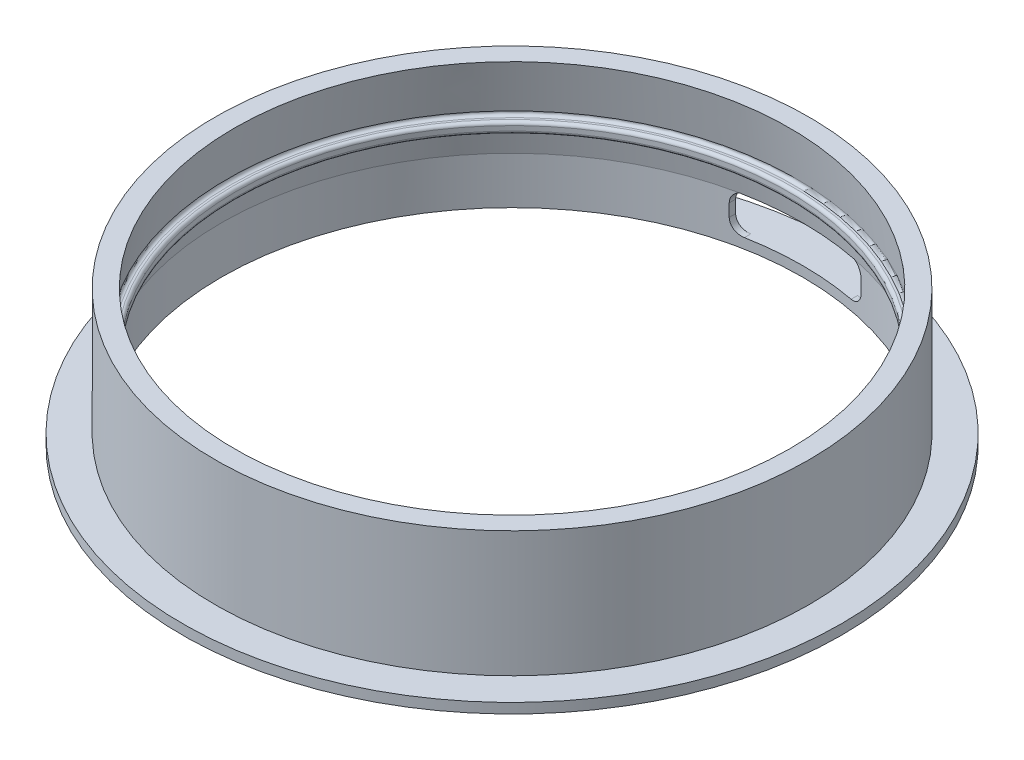
ISO-10303-21;
HEADER;
FILE_DESCRIPTION(('STEP AP214'),'2;1');
FILE_NAME('part.step','',(''),(''),'','','');
FILE_SCHEMA(('AUTOMOTIVE_DESIGN { 1 0 10303 214 1 1 1 1 }'));
ENDSEC;
DATA;
#1=APPLICATION_CONTEXT('core data for automotive mechanical design processes');
#2=APPLICATION_PROTOCOL_DEFINITION('international standard','automotive_design',2000,#1);
#3=PRODUCT_CONTEXT('',#1,'mechanical');
#4=PRODUCT('Part','Part','',(#3));
#5=PRODUCT_RELATED_PRODUCT_CATEGORY('part','',(#4));
#6=PRODUCT_DEFINITION_FORMATION('','',#4);
#7=PRODUCT_DEFINITION_CONTEXT('part definition',#1,'design');
#8=PRODUCT_DEFINITION('design','',#6,#7);
#9=PRODUCT_DEFINITION_SHAPE('','',#8);
#10=(LENGTH_UNIT() NAMED_UNIT(*) SI_UNIT(.MILLI.,.METRE.));
#11=(NAMED_UNIT(*) PLANE_ANGLE_UNIT() SI_UNIT($,.RADIAN.));
#12=(NAMED_UNIT(*) SI_UNIT($,.STERADIAN.) SOLID_ANGLE_UNIT());
#13=UNCERTAINTY_MEASURE_WITH_UNIT(LENGTH_MEASURE(1.E-05),#10,'distance_accuracy_value','');
#14=(GEOMETRIC_REPRESENTATION_CONTEXT(3) GLOBAL_UNCERTAINTY_ASSIGNED_CONTEXT((#13)) GLOBAL_UNIT_ASSIGNED_CONTEXT((#10,
#11,#12)) REPRESENTATION_CONTEXT('',''));
#15=CARTESIAN_POINT('',(0.,0.,0.));
#16=DIRECTION('',(0.,0.,1.));
#17=DIRECTION('',(1.,0.,0.));
#18=AXIS2_PLACEMENT_3D('',#15,#16,#17);
#19=CARTESIAN_POINT('',(3.43024899888577E-12,-1000.,0.));
#20=DIRECTION('',(0.,-1.,0.));
#21=DIRECTION('',(1.,0.,0.));
#22=AXIS2_PLACEMENT_3D('',#19,#20,#21);
#23=CYLINDRICAL_SURFACE('',#22,46.3);
#24=CARTESIAN_POINT('',(0.,-1.11022302462516E-13,0.));
#25=DIRECTION('',(0.,-1.,0.));
#26=DIRECTION('',(1.,0.,0.));
#27=AXIS2_PLACEMENT_3D('',#24,#25,#26);
#28=CIRCLE('',#27,46.3);
#29=CARTESIAN_POINT('',(46.3,0.,0.));
#30=VERTEX_POINT('',#29);
#31=EDGE_CURVE('E229',#30,#30,#28,.T.);
#32=ORIENTED_EDGE('',*,*,#31,.T.);
#33=EDGE_LOOP('',(#32));
#34=FACE_BOUND('',#33,.T.);
#35=CARTESIAN_POINT('',(-10.5,5.6,-45.0936802667506));
#36=CARTESIAN_POINT('',(-10.5000004104109,5.65526649087846,-45.0936795736649));
#37=CARTESIAN_POINT('',(-10.4977077190256,5.7105060555035,-45.094214086322));
#38=CARTESIAN_POINT('',(-10.4885664548555,5.82058035333635,-45.0963413854431));
#39=CARTESIAN_POINT('',(-10.4817183802295,5.87541513014727,-45.097934056191));
#40=CARTESIAN_POINT('',(-10.4544303376453,6.03853785024145,-45.1042709372307));
#41=CARTESIAN_POINT('',(-10.4272462049723,6.14571769373603,-45.1105741435007));
#42=CARTESIAN_POINT('',(-10.3557605619696,6.35384369708262,-45.1270379133283));
#43=CARTESIAN_POINT('',(-10.3114559281232,6.45478871553405,-45.1371991807563));
#44=CARTESIAN_POINT('',(-10.2071093088741,6.64776185478804,-45.1609097744737));
#45=CARTESIAN_POINT('',(-10.1470663151222,6.73978940373497,-45.1744593178456));
#46=CARTESIAN_POINT('',(-10.0121874072757,6.91359965426659,-45.2045453775855));
#47=CARTESIAN_POINT('',(-9.93717567467599,6.99523964337688,-45.2211171715226));
#48=CARTESIAN_POINT('',(-9.77499612568789,7.14484949242155,-45.2564506721741));
#49=CARTESIAN_POINT('',(-9.6878251879712,7.21281583128583,-45.2752129409922));
#50=CARTESIAN_POINT('',(-9.50154931274933,7.33481710318538,-45.3146756268316));
#51=CARTESIAN_POINT('',(-9.40220982252247,7.38848218898965,-45.3354115307399));
#52=CARTESIAN_POINT('',(-9.19608906305918,7.4783203253953,-45.3776706493196));
#53=CARTESIAN_POINT('',(-9.08931057261664,7.51449986795624,-45.3991935685939));
#54=CARTESIAN_POINT('',(-8.90179675352576,7.5608950881171,-45.4362676883281));
#55=CARTESIAN_POINT('',(-8.82212520435228,7.57554152947498,-45.4518063776837));
#56=CARTESIAN_POINT('',(-8.66166009921809,7.59509466135875,-45.4826604171018));
#57=CARTESIAN_POINT('',(-8.58086809265328,7.60001366803208,-45.4979760251795));
#58=CARTESIAN_POINT('',(-8.5,7.6,-45.513075044431));
#59=B_SPLINE_CURVE_WITH_KNOTS('',3,(#35,#36,#37,#38,#39,#40,#41,#42,#43,#44,#45,#46,#47,#48,#49,
#50,#51,#52,#53,#54,#55,#56,#57,#58),.UNSPECIFIED.,.F.,.F.,(4,2,2,2,2,2,2,2,2,2,2,4),(0.,
0.165696119068076,0.331374121241239,0.661920187394013,0.992526587877508,1.32315417533432,
1.65792179006111,1.99277549999301,2.33559445459214,2.67828603083432,2.92518226759243,
3.17176570221575),.UNSPECIFIED.);
#60=CARTESIAN_POINT('',(-10.5000000000035,5.60000000000005,-45.0936802667506));
#61=VERTEX_POINT('',#60);
#62=CARTESIAN_POINT('',(-9.12449979983976,7.50000000000004,-45.3919982309958));
#63=VERTEX_POINT('',#62);
#64=EDGE_CURVE('E129',#61,#63,#59,.T.);
#65=ORIENTED_EDGE('',*,*,#64,.T.);
#66=CARTESIAN_POINT('',(0.,7.50000000000006,0.));
#67=DIRECTION('',(0.,-1.,0.));
#68=DIRECTION('',(1.,0.,0.));
#69=AXIS2_PLACEMENT_3D('',#66,#67,#68);
#70=CIRCLE('',#69,46.3000000000001);
#71=CARTESIAN_POINT('',(9.12449979983956,7.5000000000001,-45.3919982309959));
#72=VERTEX_POINT('',#71);
#73=EDGE_CURVE('E50',#72,#63,#70,.T.);
#74=ORIENTED_EDGE('',*,*,#73,.F.);
#75=CARTESIAN_POINT('',(8.5,7.6,-45.5130750444309));
#76=CARTESIAN_POINT('',(8.55725814141848,7.59999911370923,-45.5023821645604));
#77=CARTESIAN_POINT('',(8.61446784015599,7.59753969833357,-45.4915851243363));
#78=CARTESIAN_POINT('',(8.72843797955417,7.58773514770107,-45.4698551552103));
#79=CARTESIAN_POINT('',(8.78519844317114,7.58039026374855,-45.4589222333263));
#80=CARTESIAN_POINT('',(8.95413884527806,7.5510996006173,-45.4260553035093));
#81=CARTESIAN_POINT('',(9.0651294420343,7.52189762790166,-45.4040247761624));
#82=CARTESIAN_POINT('',(9.28058443687315,7.44493846832502,-45.3604769979874));
#83=CARTESIAN_POINT('',(9.38504575350412,7.39717259596863,-45.3389599924298));
#84=CARTESIAN_POINT('',(9.58445939191577,7.28435716649275,-45.2972241427976));
#85=CARTESIAN_POINT('',(9.679413830236,7.21931146825695,-45.2770050101357));
#86=CARTESIAN_POINT('',(9.85663852416251,7.07397782900395,-45.238754161388));
#87=CARTESIAN_POINT('',(9.93896207354822,6.99375730841239,-45.2207133271641));
#88=CARTESIAN_POINT('',(10.0889193713626,6.82003953795676,-45.1874940703667));
#89=CARTESIAN_POINT('',(10.1565512654013,6.72654061454467,-45.1723160091661));
#90=CARTESIAN_POINT('',(10.2737927715804,6.53082281538272,-45.1457942639334));
#91=CARTESIAN_POINT('',(10.3237204520179,6.42880341953919,-45.1343831933545));
#92=CARTESIAN_POINT('',(10.4056491521351,6.2175030499746,-45.1155654830007));
#93=CARTESIAN_POINT('',(10.4376671458512,6.10822906212921,-45.1081550518236));
#94=CARTESIAN_POINT('',(10.4734274796726,5.93171903273268,-45.099861350266));
#95=CARTESIAN_POINT('',(10.4833858570636,5.86574616555138,-45.0975464701491));
#96=CARTESIAN_POINT('',(10.4966703603771,5.73319306287905,-45.0944556223757));
#97=CARTESIAN_POINT('',(10.5000056555532,5.66661379546546,-45.0936775271423));
#98=CARTESIAN_POINT('',(10.5,5.60000000000004,-45.0936802667514));
#99=B_SPLINE_CURVE_WITH_KNOTS('',3,(#75,#76,#77,#78,#79,#80,#81,#82,#83,#84,#85,#86,#87,#88,#89,
#90,#91,#92,#93,#94,#95,#96,#97,#98),.UNSPECIFIED.,.F.,.F.,(4,2,2,2,2,2,2,2,2,2,2,4),(0.,
0.174635821586464,0.349262660750496,0.698059388238651,1.0470195041614,1.39590175667445,
1.74326889089933,2.09067984457726,2.43148863990916,2.77197388154683,2.97193698786964,
3.171623063917),.UNSPECIFIED.);
#100=CARTESIAN_POINT('',(10.4999999999968,5.60000000000005,-45.0936802667521));
#101=VERTEX_POINT('',#100);
#102=EDGE_CURVE('E178',#72,#101,#99,.T.);
#103=ORIENTED_EDGE('',*,*,#102,.T.);
#104=DIRECTION('',(0.,-1.,0.));
#105=VECTOR('',#104,1.);
#106=CARTESIAN_POINT('',(10.5000000000003,-1000.,-45.0936802667521));
#107=LINE('',#106,#105);
#108=CARTESIAN_POINT('',(10.4999999999968,3.59999999999983,-45.0936802667521));
#109=VERTEX_POINT('',#108);
#110=EDGE_CURVE('E243',#101,#109,#107,.T.);
#111=ORIENTED_EDGE('',*,*,#110,.T.);
#112=CARTESIAN_POINT('',(10.5,3.59999999999986,-45.0936802667521));
#113=CARTESIAN_POINT('',(10.5000004104109,3.54473350912139,-45.0936795736654));
#114=CARTESIAN_POINT('',(10.4977077190256,3.48949394449634,-45.0942140863221));
#115=CARTESIAN_POINT('',(10.4885664548555,3.37941964666348,-45.0963413854429));
#116=CARTESIAN_POINT('',(10.4817183802295,3.32458486985257,-45.0979340561909));
#117=CARTESIAN_POINT('',(10.4544303376453,3.16146214975839,-45.1042709372308));
#118=CARTESIAN_POINT('',(10.4272462049723,3.05428230626382,-45.1105741435007));
#119=CARTESIAN_POINT('',(10.3557605619696,2.84615630291723,-45.1270379133282));
#120=CARTESIAN_POINT('',(10.3114559281232,2.74521128446581,-45.1371991807563));
#121=CARTESIAN_POINT('',(10.2071093088741,2.55223814521182,-45.1609097744737));
#122=CARTESIAN_POINT('',(10.1470663151222,2.46021059626488,-45.1744593178456));
#123=CARTESIAN_POINT('',(10.0121874072757,2.28640034573326,-45.2045453775855));
#124=CARTESIAN_POINT('',(9.93717567467598,2.20476035662297,-45.2211171715226));
#125=CARTESIAN_POINT('',(9.77499612568787,2.0551505075783,-45.2564506721741));
#126=CARTESIAN_POINT('',(9.68782518797118,1.98718416871402,-45.2752129409922));
#127=CARTESIAN_POINT('',(9.50154931274931,1.86518289681447,-45.3146756268316));
#128=CARTESIAN_POINT('',(9.40220982252245,1.8115178110102,-45.3354115307399));
#129=CARTESIAN_POINT('',(9.19608906305917,1.72167967460456,-45.3776706493196));
#130=CARTESIAN_POINT('',(9.08931057261662,1.68550013204362,-45.3991935685939));
#131=CARTESIAN_POINT('',(8.90179675352575,1.63910491188277,-45.4362676883281));
#132=CARTESIAN_POINT('',(8.82212520435226,1.62445847052488,-45.4518063776837));
#133=CARTESIAN_POINT('',(8.66166009921809,1.60490533864111,-45.4826604171018));
#134=CARTESIAN_POINT('',(8.58086809265329,1.59998633196778,-45.4979760251795));
#135=CARTESIAN_POINT('',(8.50000000000001,1.59999999999986,-45.5130750444309));
#136=B_SPLINE_CURVE_WITH_KNOTS('',3,(#112,#113,#114,#115,#116,#117,#118,#119,#120,#121,#122,
#123,#124,#125,#126,#127,#128,#129,#130,#131,#132,#133,#134,#135),.UNSPECIFIED.,.F.,.F.,(4,2,2,
2,2,2,2,2,2,2,2,4),(0.,0.165696119068094,0.331374121241258,0.661920187394008,0.992526587877502,
1.32315417533433,1.65792179006112,1.99277549999302,2.33559445459214,2.67828603083433,
2.92518226759242,3.17176570221572),.UNSPECIFIED.);
#137=CARTESIAN_POINT('',(8.50000000000001,1.60000000000005,-45.5130750444309));
#138=VERTEX_POINT('',#137);
#139=EDGE_CURVE('E166',#109,#138,#136,.T.);
#140=ORIENTED_EDGE('',*,*,#139,.T.);
#141=CARTESIAN_POINT('',(0.,1.60000000000005,0.));
#142=DIRECTION('',(0.,-1.,0.));
#143=DIRECTION('',(1.,0.,0.));
#144=AXIS2_PLACEMENT_3D('',#141,#142,#143);
#145=CIRCLE('',#144,46.3);
#146=CARTESIAN_POINT('',(-8.49999999999999,1.60000000000005,-45.513075044431));
#147=VERTEX_POINT('',#146);
#148=EDGE_CURVE('E245',#138,#147,#145,.F.);
#149=ORIENTED_EDGE('',*,*,#148,.T.);
#150=CARTESIAN_POINT('',(-8.49999999999999,1.5999999999998,-45.513075044431));
#151=CARTESIAN_POINT('',(-8.55725814141847,1.60000088629058,-45.5023821645604));
#152=CARTESIAN_POINT('',(-8.61446784015599,1.60246030166624,-45.4915851243363));
#153=CARTESIAN_POINT('',(-8.72843797955416,1.61226485229874,-45.4698551552103));
#154=CARTESIAN_POINT('',(-8.78519844317113,1.61960973625126,-45.4589222333263));
#155=CARTESIAN_POINT('',(-8.95413884527806,1.64890039938251,-45.4260553035093));
#156=CARTESIAN_POINT('',(-9.06512944203429,1.67810237209814,-45.4040247761624));
#157=CARTESIAN_POINT('',(-9.28058443687314,1.75506153167478,-45.3604769979874));
#158=CARTESIAN_POINT('',(-9.38504575350411,1.80282740403118,-45.3389599924298));
#159=CARTESIAN_POINT('',(-9.58445939191576,1.91564283350705,-45.2972241427976));
#160=CARTESIAN_POINT('',(-9.679413830236,1.98068853174285,-45.2770050101357));
#161=CARTESIAN_POINT('',(-9.8566385241625,2.12602217099585,-45.238754161388));
#162=CARTESIAN_POINT('',(-9.93896207354821,2.20624269158741,-45.2207133271641));
#163=CARTESIAN_POINT('',(-10.0889193713626,2.37996046204304,-45.1874940703667));
#164=CARTESIAN_POINT('',(-10.1565512654013,2.47345938545513,-45.1723160091661));
#165=CARTESIAN_POINT('',(-10.2737927715804,2.66917718461708,-45.1457942639334));
#166=CARTESIAN_POINT('',(-10.3237204520179,2.77119658046061,-45.1343831933545));
#167=CARTESIAN_POINT('',(-10.4056491521351,2.9824969500252,-45.1155654830007));
#168=CARTESIAN_POINT('',(-10.4376671458512,3.09177093787059,-45.1081550518236));
#169=CARTESIAN_POINT('',(-10.4734274796726,3.26828096726713,-45.099861350266));
#170=CARTESIAN_POINT('',(-10.4833858570636,3.33425383444845,-45.0975464701491));
#171=CARTESIAN_POINT('',(-10.4966703603771,3.46680693712081,-45.0944556223757));
#172=CARTESIAN_POINT('',(-10.5000056555532,3.5333862045344,-45.0936775271423));
#173=CARTESIAN_POINT('',(-10.5,3.59999999999984,-45.0936802667514));
#174=B_SPLINE_CURVE_WITH_KNOTS('',3,(#150,#151,#152,#153,#154,#155,#156,#157,#158,#159,#160,
#161,#162,#163,#164,#165,#166,#167,#168,#169,#170,#171,#172,#173),.UNSPECIFIED.,.F.,.F.,(4,2,2,
2,2,2,2,2,2,2,2,4),(0.,0.174635821586464,0.349262660750496,0.69805938823865,1.0470195041614,
1.39590175667445,1.74326889089932,2.09067984457726,2.43148863990916,2.77197388154683,
2.97193698786968,3.17162306391708),.UNSPECIFIED.);
#175=CARTESIAN_POINT('',(-10.5000000000034,3.59999999999983,-45.0936802667506));
#176=VERTEX_POINT('',#175);
#177=EDGE_CURVE('E302',#147,#176,#174,.T.);
#178=ORIENTED_EDGE('',*,*,#177,.T.);
#179=DIRECTION('',(0.,-1.,0.));
#180=VECTOR('',#179,1.);
#181=CARTESIAN_POINT('',(-10.5,-1000.,-45.0936802667506));
#182=LINE('',#181,#180);
#183=EDGE_CURVE('E247',#176,#61,#182,.F.);
#184=ORIENTED_EDGE('',*,*,#183,.T.);
#185=EDGE_LOOP('',(#65,#74,#103,#111,#140,#149,#178,#184));
#186=FACE_BOUND('',#185,.T.);
#187=ADVANCED_FACE('F35',(#34,#186),#23,.F.);
#188=CARTESIAN_POINT('',(52.5,0.,0.));
#189=DIRECTION('',(0.,-1.,0.));
#190=DIRECTION('',(1.,0.,0.));
#191=AXIS2_PLACEMENT_3D('',#188,#189,#190);
#192=PLANE('',#191);
#193=CARTESIAN_POINT('',(0.,-2.22044604925031E-13,0.));
#194=DIRECTION('',(0.,-1.,0.));
#195=DIRECTION('',(1.,0.,0.));
#196=AXIS2_PLACEMENT_3D('',#193,#194,#195);
#197=CIRCLE('',#196,52.5);
#198=CARTESIAN_POINT('',(52.5,0.,0.));
#199=VERTEX_POINT('',#198);
#200=EDGE_CURVE('E122',#199,#199,#197,.T.);
#201=ORIENTED_EDGE('',*,*,#200,.T.);
#202=EDGE_LOOP('',(#201));
#203=FACE_BOUND('',#202,.T.);
#204=ORIENTED_EDGE('',*,*,#31,.F.);
#205=EDGE_LOOP('',(#204));
#206=FACE_BOUND('',#205,.T.);
#207=ADVANCED_FACE('F159',(#203,#206),#192,.T.);
#208=CARTESIAN_POINT('',(46.3,21.6,0.));
#209=DIRECTION('',(0.,1.,0.));
#210=DIRECTION('',(-1.,0.,0.));
#211=AXIS2_PLACEMENT_3D('',#208,#209,#210);
#212=PLANE('',#211);
#213=CARTESIAN_POINT('',(0.,21.5999999999998,0.));
#214=DIRECTION('',(0.,-1.,0.));
#215=DIRECTION('',(1.,0.,0.));
#216=AXIS2_PLACEMENT_3D('',#213,#214,#215);
#217=CIRCLE('',#216,47.3000000000001);
#218=CARTESIAN_POINT('',(47.3,21.6,0.));
#219=VERTEX_POINT('',#218);
#220=EDGE_CURVE('E232',#219,#219,#217,.T.);
#221=ORIENTED_EDGE('',*,*,#220,.F.);
#222=EDGE_LOOP('',(#221));
#223=FACE_BOUND('',#222,.T.);
#224=CARTESIAN_POINT('',(0.,21.5999999999998,0.));
#225=DIRECTION('',(0.,-1.,0.));
#226=DIRECTION('',(1.,0.,0.));
#227=AXIS2_PLACEMENT_3D('',#224,#225,#226);
#228=CIRCLE('',#227,44.2430324539306);
#229=CARTESIAN_POINT('',(44.2430324539305,21.6,0.));
#230=VERTEX_POINT('',#229);
#231=EDGE_CURVE('E254',#230,#230,#228,.T.);
#232=ORIENTED_EDGE('',*,*,#231,.T.);
#233=EDGE_LOOP('',(#232));
#234=FACE_BOUND('',#233,.T.);
#235=ADVANCED_FACE('F161',(#223,#234),#212,.T.);
#236=CARTESIAN_POINT('',(3.43024899888577E-12,-1000.,0.));
#237=DIRECTION('',(0.,-1.,0.));
#238=DIRECTION('',(1.,0.,0.));
#239=AXIS2_PLACEMENT_3D('',#236,#237,#238);
#240=CYLINDRICAL_SURFACE('',#239,47.3);
#241=CARTESIAN_POINT('',(0.,1.59999999999982,0.));
#242=DIRECTION('',(0.,-1.,0.));
#243=DIRECTION('',(1.,0.,0.));
#244=AXIS2_PLACEMENT_3D('',#241,#242,#243);
#245=CIRCLE('',#244,47.3);
#246=CARTESIAN_POINT('',(8.50000000000001,1.59999999999985,-46.5299903288191));
#247=VERTEX_POINT('',#246);
#248=CARTESIAN_POINT('',(-8.49999999999999,1.59999999999979,-46.5299903288191));
#249=VERTEX_POINT('',#248);
#250=EDGE_CURVE('E235',#247,#249,#245,.T.);
#251=ORIENTED_EDGE('',*,*,#250,.F.);
#252=CARTESIAN_POINT('',(8.50000000000001,1.59999999999986,-46.5299903288191));
#253=CARTESIAN_POINT('',(8.55721519521034,1.6000008634994,-46.5195389860332));
#254=CARTESIAN_POINT('',(8.61438290727646,1.60245661723587,-46.5089859108734));
#255=CARTESIAN_POINT('',(8.72827116443651,1.61224688353465,-46.4877470949142));
#256=CARTESIAN_POINT('',(8.78499173229826,1.61958114604677,-46.4770613609418));
#257=CARTESIAN_POINT('',(8.9538142634333,1.64882973023119,-46.4449380870026));
#258=CARTESIAN_POINT('',(9.06473027557096,1.67799003127617,-46.4234064515995));
#259=CARTESIAN_POINT('',(9.28004633680688,1.75483916259681,-46.3808454503382));
#260=CARTESIAN_POINT('',(9.38444330466908,1.80253667872022,-46.3598163248478));
#261=CARTESIAN_POINT('',(9.58374095210596,1.91518666138444,-46.3190269246161));
#262=CARTESIAN_POINT('',(9.6786437284198,1.98013530647785,-46.2992663700648));
#263=CARTESIAN_POINT('',(9.85580063065431,2.12525777324984,-46.2618781970105));
#264=CARTESIAN_POINT('',(9.93810564065184,2.20536725645866,-46.2442420627267));
#265=CARTESIAN_POINT('',(10.0880481480493,2.37883587725589,-46.211764580637));
#266=CARTESIAN_POINT('',(10.1556837435063,2.47219673033953,-46.196923595265));
#267=CARTESIAN_POINT('',(10.2730156953669,2.6677002989581,-46.1709725587537));
#268=CARTESIAN_POINT('',(10.3230156894807,2.76965261598304,-46.1597996138923));
#269=CARTESIAN_POINT('',(10.4051021093171,2.98081721020521,-46.1413657784589));
#270=CARTESIAN_POINT('',(10.4372052110421,3.09002262253275,-46.1341012463194));
#271=CARTESIAN_POINT('',(10.4731816240238,3.26675968204466,-46.1259433170591));
#272=CARTESIAN_POINT('',(10.4832321353955,3.33303221096325,-46.1236590273683));
#273=CARTESIAN_POINT('',(10.4966395977057,3.46619230374409,-46.1206089919021));
#274=CARTESIAN_POINT('',(10.5000058092166,3.53307888754651,-46.119841145222));
#275=CARTESIAN_POINT('',(10.5,3.59999999999983,-46.1198438852519));
#276=B_SPLINE_CURVE_WITH_KNOTS('',3,(#252,#253,#254,#255,#256,#257,#258,#259,#260,#261,#262,
#263,#264,#265,#266,#267,#268,#269,#270,#271,#272,#273,#274,#275),.UNSPECIFIED.,.F.,.F.,(4,2,2,
2,2,2,2,2,2,2,2,4),(0.,0.174377713312374,0.348746489503751,0.697022685167776,1.04546226720121,
1.39382472763619,1.74074070139276,2.08770162721303,2.42835801406406,2.76869645060741,
2.96958196715321,3.17018897787325),.UNSPECIFIED.);
#277=CARTESIAN_POINT('',(10.4999999999968,3.59999999999983,-46.1198438852526));
#278=VERTEX_POINT('',#277);
#279=EDGE_CURVE('E179',#247,#278,#276,.T.);
#280=ORIENTED_EDGE('',*,*,#279,.T.);
#281=DIRECTION('',(0.,-1.,0.));
#282=VECTOR('',#281,1.);
#283=CARTESIAN_POINT('',(10.5000000000003,-1000.,-46.1198438852526));
#284=LINE('',#283,#282);
#285=CARTESIAN_POINT('',(10.4999999999968,5.60000000000005,-46.1198438852526));
#286=VERTEX_POINT('',#285);
#287=EDGE_CURVE('E249',#278,#286,#284,.F.);
#288=ORIENTED_EDGE('',*,*,#287,.T.);
#289=CARTESIAN_POINT('',(10.5,5.6,-46.1198438852526));
#290=CARTESIAN_POINT('',(10.5000003781006,5.65530884499776,-46.1198432145681));
#291=CARTESIAN_POINT('',(10.4977042065435,5.71059076314212,-46.120366627172));
#292=CARTESIAN_POINT('',(10.4885488438328,5.82074987402876,-46.1224498026853));
#293=CARTESIAN_POINT('',(10.4816901396209,5.87562710932944,-46.1240094550007));
#294=CARTESIAN_POINT('',(10.4543586050192,6.0388804905627,-46.1302152283225));
#295=CARTESIAN_POINT('',(10.4271300140919,6.14614833148609,-46.1363882877849));
#296=CARTESIAN_POINT('',(10.3555211399181,6.35444778369144,-46.1525135964818));
#297=CARTESIAN_POINT('',(10.3111375099058,6.45547817365001,-46.1624665831334));
#298=CARTESIAN_POINT('',(10.2065961164147,6.64860956958886,-46.1856931555087));
#299=CARTESIAN_POINT('',(10.1464374994643,6.74071009206851,-46.1989669208943));
#300=CARTESIAN_POINT('',(10.011323917118,6.91459938673835,-46.2284351577555));
#301=CARTESIAN_POINT('',(9.93620004664698,6.99625114444492,-46.2446627685688));
#302=CARTESIAN_POINT('',(9.77377478930602,7.14586312756231,-46.2792632828247));
#303=CARTESIAN_POINT('',(9.68647030292857,7.21381985731209,-46.2976367321077));
#304=CARTESIAN_POINT('',(9.50000262139562,7.3357088503788,-46.3362623589015));
#305=CARTESIAN_POINT('',(9.40061459024129,7.38928637299787,-46.3565477992561));
#306=CARTESIAN_POINT('',(9.19440579981976,7.47894344025071,-46.3978872253711));
#307=CARTESIAN_POINT('',(9.08758788405316,7.5150296373358,-46.4189409156631));
#308=CARTESIAN_POINT('',(8.90031648320776,7.56118551707108,-46.4551473887422));
#309=CARTESIAN_POINT('',(8.82093146486017,7.57572358028273,-46.4702884289028));
#310=CARTESIAN_POINT('',(8.66105458201475,7.59513141970994,-46.500352978227));
#311=CARTESIAN_POINT('',(8.58056425590126,7.60001348541859,-46.5152767398699));
#312=CARTESIAN_POINT('',(8.5,7.6,-46.5299903288191));
#313=B_SPLINE_CURVE_WITH_KNOTS('',3,(#289,#290,#291,#292,#293,#294,#295,#296,#297,#298,#299,
#300,#301,#302,#303,#304,#305,#306,#307,#308,#309,#310,#311,#312),.UNSPECIFIED.,.F.,.F.,(4,2,2,
2,2,2,2,2,2,2,2,4),(0.,0.165823169554723,0.331628644272374,0.662439986468388,0.993315899041781,
1.3242097166382,1.65907455084517,1.99402475146713,2.33660509174634,2.67905503649066,
2.92484675509681,3.17032544499864),.UNSPECIFIED.);
#314=CARTESIAN_POINT('',(8.5,7.60000000000005,-46.5299903288191));
#315=VERTEX_POINT('',#314);
#316=EDGE_CURVE('E130',#286,#315,#313,.T.);
#317=ORIENTED_EDGE('',*,*,#316,.T.);
#318=CARTESIAN_POINT('',(0.,7.60000000000005,0.));
#319=DIRECTION('',(0.,1.,0.));
#320=DIRECTION('',(0.,0.,1.));
#321=AXIS2_PLACEMENT_3D('',#318,#319,#320);
#322=CIRCLE('',#321,47.3);
#323=CARTESIAN_POINT('',(-8.5,7.60000000000005,-46.5299903288192));
#324=VERTEX_POINT('',#323);
#325=EDGE_CURVE('E123',#315,#324,#322,.T.);
#326=ORIENTED_EDGE('',*,*,#325,.T.);
#327=CARTESIAN_POINT('',(-8.5,7.6,-46.5299903288191));
#328=CARTESIAN_POINT('',(-8.55721519521033,7.59999913650046,-46.5195389860332));
#329=CARTESIAN_POINT('',(-8.61438290727645,7.597543382764,-46.5089859108734));
#330=CARTESIAN_POINT('',(-8.7282711644365,7.58775311646522,-46.4877470949142));
#331=CARTESIAN_POINT('',(-8.78499173229825,7.58041885395309,-46.4770613609418));
#332=CARTESIAN_POINT('',(-8.95381426343329,7.55117026976868,-46.4449380870026));
#333=CARTESIAN_POINT('',(-9.06473027557095,7.5220099687237,-46.4234064515995));
#334=CARTESIAN_POINT('',(-9.28004633680687,7.44516083740306,-46.3808454503383));
#335=CARTESIAN_POINT('',(-9.38444330466907,7.39746332127965,-46.3598163248478));
#336=CARTESIAN_POINT('',(-9.58374095210596,7.28481333861543,-46.3190269246161));
#337=CARTESIAN_POINT('',(-9.67864372841979,7.21986469352202,-46.2992663700648));
#338=CARTESIAN_POINT('',(-9.85580063065431,7.07474222675003,-46.2618781970106));
#339=CARTESIAN_POINT('',(-9.93810564065183,6.99463274354121,-46.2442420627267));
#340=CARTESIAN_POINT('',(-10.0880481480493,6.82116412274398,-46.211764580637));
#341=CARTESIAN_POINT('',(-10.1556837435063,6.72780326966034,-46.196923595265));
#342=CARTESIAN_POINT('',(-10.2730156953669,6.53229970104177,-46.1709725587537));
#343=CARTESIAN_POINT('',(-10.3230156894807,6.43034738401683,-46.1597996138923));
#344=CARTESIAN_POINT('',(-10.4051021093171,6.21918278979466,-46.1413657784589));
#345=CARTESIAN_POINT('',(-10.4372052110421,6.10997737746712,-46.1341012463194));
#346=CARTESIAN_POINT('',(-10.4731816240238,5.9332403179552,-46.1259433170591));
#347=CARTESIAN_POINT('',(-10.4832321353955,5.86696778903659,-46.1236590273683));
#348=CARTESIAN_POINT('',(-10.4966395977057,5.73380769625573,-46.1206089919021));
#349=CARTESIAN_POINT('',(-10.5000058092167,5.6669211124533,-46.119841145222));
#350=CARTESIAN_POINT('',(-10.5,5.59999999999997,-46.1198438852519));
#351=B_SPLINE_CURVE_WITH_KNOTS('',3,(#327,#328,#329,#330,#331,#332,#333,#334,#335,#336,#337,
#338,#339,#340,#341,#342,#343,#344,#345,#346,#347,#348,#349,#350),.UNSPECIFIED.,.F.,.F.,(4,2,2,
2,2,2,2,2,2,2,2,4),(0.,0.174377713312372,0.348746489503753,0.697022685167777,1.04546226720122,
1.39382472763619,1.74074070139276,2.08770162721304,2.42835801406407,2.76869645060741,
2.96958196715325,3.17018897787333),.UNSPECIFIED.);
#352=CARTESIAN_POINT('',(-10.5000000000035,5.60000000000005,-46.1198438852511));
#353=VERTEX_POINT('',#352);
#354=EDGE_CURVE('E108',#324,#353,#351,.T.);
#355=ORIENTED_EDGE('',*,*,#354,.T.);
#356=DIRECTION('',(0.,-1.,0.));
#357=VECTOR('',#356,1.);
#358=CARTESIAN_POINT('',(-10.5,-1000.,-46.1198438852511));
#359=LINE('',#358,#357);
#360=CARTESIAN_POINT('',(-10.5000000000034,3.59999999999983,-46.1198438852511));
#361=VERTEX_POINT('',#360);
#362=EDGE_CURVE('E251',#353,#361,#359,.T.);
#363=ORIENTED_EDGE('',*,*,#362,.T.);
#364=CARTESIAN_POINT('',(-10.5,3.5999999999998,-46.1198438852511));
#365=CARTESIAN_POINT('',(-10.5000003781006,3.54469115500207,-46.1198432145675));
#366=CARTESIAN_POINT('',(-10.4977042065435,3.48940923685771,-46.1203666271719));
#367=CARTESIAN_POINT('',(-10.4885488438328,3.37925012597108,-46.1224498026855));
#368=CARTESIAN_POINT('',(-10.4816901396209,3.3243728906704,-46.1240094550008));
#369=CARTESIAN_POINT('',(-10.4543586050192,3.16111950943713,-46.1302152283224));
#370=CARTESIAN_POINT('',(-10.4271300140919,3.05385166851374,-46.1363882877849));
#371=CARTESIAN_POINT('',(-10.3555211399181,2.84555221630837,-46.1525135964819));
#372=CARTESIAN_POINT('',(-10.3111375099058,2.74452182634981,-46.1624665831334));
#373=CARTESIAN_POINT('',(-10.2065961164147,2.55139043041096,-46.1856931555087));
#374=CARTESIAN_POINT('',(-10.1464374994643,2.45928990793131,-46.1989669208943));
#375=CARTESIAN_POINT('',(-10.011323917118,2.28540061326147,-46.2284351577555));
#376=CARTESIAN_POINT('',(-9.936200046647,2.2037488555549,-46.2446627685688));
#377=CARTESIAN_POINT('',(-9.77377478930604,2.05413687243751,-46.2792632828247));
#378=CARTESIAN_POINT('',(-9.68647030292859,1.98618014268773,-46.2976367321077));
#379=CARTESIAN_POINT('',(-9.50000262139563,1.86429114962101,-46.3362623589015));
#380=CARTESIAN_POINT('',(-9.4006145902413,1.81071362700195,-46.3565477992561));
#381=CARTESIAN_POINT('',(-9.19440579981978,1.7210565597491,-46.3978872253711));
#382=CARTESIAN_POINT('',(-9.08758788405317,1.68497036266401,-46.4189409156631));
#383=CARTESIAN_POINT('',(-8.90031648320778,1.63881448292873,-46.4551473887422));
#384=CARTESIAN_POINT('',(-8.82093146486018,1.62427641971708,-46.4702884289028));
#385=CARTESIAN_POINT('',(-8.66105458201475,1.60486858028987,-46.500352978227));
#386=CARTESIAN_POINT('',(-8.58056425590126,1.59998651458121,-46.5152767398699));
#387=CARTESIAN_POINT('',(-8.5,1.5999999999998,-46.5299903288192));
#388=B_SPLINE_CURVE_WITH_KNOTS('',3,(#364,#365,#366,#367,#368,#369,#370,#371,#372,#373,#374,
#375,#376,#377,#378,#379,#380,#381,#382,#383,#384,#385,#386,#387),.UNSPECIFIED.,.F.,.F.,(4,2,2,
2,2,2,2,2,2,2,2,4),(0.,0.165823169554706,0.331628644272355,0.662439986468392,0.993315899041787,
1.32420971663819,1.65907455084516,1.99402475146713,2.33660509174634,2.67905503649066,
2.92484675509682,3.17032544499865),.UNSPECIFIED.);
#389=EDGE_CURVE('E294',#361,#249,#388,.T.);
#390=ORIENTED_EDGE('',*,*,#389,.T.);
#391=EDGE_LOOP('',(#251,#280,#288,#317,#326,#355,#363,#390));
#392=FACE_BOUND('',#391,.T.);
#393=ORIENTED_EDGE('',*,*,#220,.T.);
#394=EDGE_LOOP('',(#393));
#395=FACE_BOUND('',#394,.T.);
#396=ADVANCED_FACE('F286',(#392,#395),#240,.T.);
#397=CARTESIAN_POINT('',(47.3,1.59999999999999,0.));
#398=DIRECTION('',(0.,1.,0.));
#399=DIRECTION('',(-1.,0.,0.));
#400=AXIS2_PLACEMENT_3D('',#397,#398,#399);
#401=PLANE('',#400);
#402=ORIENTED_EDGE('',*,*,#148,.F.);
#403=DIRECTION('',(0.,0.,1.));
#404=VECTOR('',#403,1.);
#405=CARTESIAN_POINT('',(8.50000000000001,1.59999999999986,0.));
#406=LINE('',#405,#404);
#407=EDGE_CURVE('E113',#138,#247,#406,.F.);
#408=ORIENTED_EDGE('',*,*,#407,.T.);
#409=ORIENTED_EDGE('',*,*,#250,.T.);
#410=DIRECTION('',(0.,0.,1.));
#411=VECTOR('',#410,1.);
#412=CARTESIAN_POINT('',(-8.49999999999999,1.5999999999998,0.));
#413=LINE('',#412,#411);
#414=EDGE_CURVE('E223',#249,#147,#413,.T.);
#415=ORIENTED_EDGE('',*,*,#414,.T.);
#416=EDGE_LOOP('',(#402,#408,#409,#415));
#417=FACE_BOUND('',#416,.T.);
#418=CARTESIAN_POINT('',(0.,1.59999999999982,0.));
#419=DIRECTION('',(0.,-1.,0.));
#420=DIRECTION('',(1.,0.,0.));
#421=AXIS2_PLACEMENT_3D('',#418,#419,#420);
#422=CIRCLE('',#421,52.5);
#423=CARTESIAN_POINT('',(52.5,1.6,0.));
#424=VERTEX_POINT('',#423);
#425=EDGE_CURVE('E237',#424,#424,#422,.T.);
#426=ORIENTED_EDGE('',*,*,#425,.F.);
#427=EDGE_LOOP('',(#426));
#428=FACE_BOUND('',#427,.T.);
#429=ADVANCED_FACE('F283',(#417,#428),#401,.T.);
#430=CARTESIAN_POINT('',(3.43024899888577E-12,-1000.,0.));
#431=DIRECTION('',(0.,-1.,0.));
#432=DIRECTION('',(1.,0.,0.));
#433=AXIS2_PLACEMENT_3D('',#430,#431,#432);
#434=CYLINDRICAL_SURFACE('',#433,52.5);
#435=ORIENTED_EDGE('',*,*,#425,.T.);
#436=EDGE_LOOP('',(#435));
#437=FACE_BOUND('',#436,.T.);
#438=ORIENTED_EDGE('',*,*,#200,.F.);
#439=EDGE_LOOP('',(#438));
#440=FACE_BOUND('',#439,.T.);
#441=ADVANCED_FACE('F277',(#437,#440),#434,.T.);
#442=CARTESIAN_POINT('',(-10.5,7.6,-52.501));
#443=DIRECTION('',(0.,1.,0.));
#444=DIRECTION('',(0.,0.,1.));
#445=AXIS2_PLACEMENT_3D('',#442,#443,#444);
#446=PLANE('',#445);
#447=ORIENTED_EDGE('',*,*,#325,.F.);
#448=DIRECTION('',(0.,0.,1.));
#449=VECTOR('',#448,1.);
#450=CARTESIAN_POINT('',(8.5,7.6,-45.0936802667514));
#451=LINE('',#450,#449);
#452=CARTESIAN_POINT('',(8.5,7.60000000000005,-45.5130750444309));
#453=VERTEX_POINT('',#452);
#454=EDGE_CURVE('E112',#315,#453,#451,.T.);
#455=ORIENTED_EDGE('',*,*,#454,.T.);
#456=CARTESIAN_POINT('',(0.,7.60000000000005,0.));
#457=DIRECTION('',(0.,1.,0.));
#458=DIRECTION('',(0.,0.,1.));
#459=AXIS2_PLACEMENT_3D('',#456,#457,#458);
#460=CIRCLE('',#459,46.3);
#461=CARTESIAN_POINT('',(-8.5,7.6,-45.513075044431));
#462=VERTEX_POINT('',#461);
#463=EDGE_CURVE('E117',#462,#453,#460,.F.);
#464=ORIENTED_EDGE('',*,*,#463,.F.);
#465=DIRECTION('',(0.,0.,1.));
#466=VECTOR('',#465,1.);
#467=CARTESIAN_POINT('',(-8.5,7.6,-46.1198438852519));
#468=LINE('',#467,#466);
#469=EDGE_CURVE('E104',#462,#324,#468,.F.);
#470=ORIENTED_EDGE('',*,*,#469,.T.);
#471=EDGE_LOOP('',(#447,#455,#464,#470));
#472=FACE_BOUND('',#471,.T.);
#473=ADVANCED_FACE('F118',(#472),#446,.F.);
#474=CARTESIAN_POINT('',(10.5,7.6,-52.501));
#475=DIRECTION('',(1.,0.,0.));
#476=DIRECTION('',(0.,1.,0.));
#477=AXIS2_PLACEMENT_3D('',#474,#475,#476);
#478=PLANE('',#477);
#479=ORIENTED_EDGE('',*,*,#287,.F.);
#480=DIRECTION('',(0.,0.,1.));
#481=VECTOR('',#480,1.);
#482=CARTESIAN_POINT('',(10.5,3.59999999999986,-52.501));
#483=LINE('',#482,#481);
#484=EDGE_CURVE('E206',#278,#109,#483,.T.);
#485=ORIENTED_EDGE('',*,*,#484,.T.);
#486=ORIENTED_EDGE('',*,*,#110,.F.);
#487=DIRECTION('',(0.,0.,1.));
#488=VECTOR('',#487,1.);
#489=CARTESIAN_POINT('',(10.5,5.6,-46.1198438852519));
#490=LINE('',#489,#488);
#491=EDGE_CURVE('E227',#101,#286,#490,.F.);
#492=ORIENTED_EDGE('',*,*,#491,.T.);
#493=EDGE_LOOP('',(#479,#485,#486,#492));
#494=FACE_BOUND('',#493,.T.);
#495=ADVANCED_FACE('F198',(#494),#478,.F.);
#496=CARTESIAN_POINT('',(-10.5,7.6,-52.501));
#497=DIRECTION('',(-1.,0.,0.));
#498=DIRECTION('',(0.,0.,1.));
#499=AXIS2_PLACEMENT_3D('',#496,#497,#498);
#500=PLANE('',#499);
#501=ORIENTED_EDGE('',*,*,#362,.F.);
#502=DIRECTION('',(0.,0.,1.));
#503=VECTOR('',#502,1.);
#504=CARTESIAN_POINT('',(-10.5,5.6,-45.0936802667506));
#505=LINE('',#504,#503);
#506=EDGE_CURVE('E210',#353,#61,#505,.T.);
#507=ORIENTED_EDGE('',*,*,#506,.T.);
#508=ORIENTED_EDGE('',*,*,#183,.F.);
#509=DIRECTION('',(0.,0.,1.));
#510=VECTOR('',#509,1.);
#511=CARTESIAN_POINT('',(-10.5,3.5999999999998,-52.501));
#512=LINE('',#511,#510);
#513=EDGE_CURVE('E215',#176,#361,#512,.F.);
#514=ORIENTED_EDGE('',*,*,#513,.T.);
#515=EDGE_LOOP('',(#501,#507,#508,#514));
#516=FACE_BOUND('',#515,.T.);
#517=ADVANCED_FACE('F192',(#516),#500,.F.);
#518=CARTESIAN_POINT('',(8.5,3.59999999999986,-52.501));
#519=DIRECTION('',(0.,0.,1.));
#520=DIRECTION('',(1.,0.,0.));
#521=AXIS2_PLACEMENT_3D('',#518,#519,#520);
#522=CYLINDRICAL_SURFACE('',#521,2.);
#523=ORIENTED_EDGE('',*,*,#279,.F.);
#524=ORIENTED_EDGE('',*,*,#407,.F.);
#525=ORIENTED_EDGE('',*,*,#139,.F.);
#526=ORIENTED_EDGE('',*,*,#484,.F.);
#527=EDGE_LOOP('',(#523,#524,#525,#526));
#528=FACE_BOUND('',#527,.T.);
#529=ADVANCED_FACE('F187',(#528),#522,.F.);
#530=CARTESIAN_POINT('',(8.5,5.6,-52.501));
#531=DIRECTION('',(0.,0.,-1.));
#532=DIRECTION('',(-1.,0.,0.));
#533=AXIS2_PLACEMENT_3D('',#530,#531,#532);
#534=CYLINDRICAL_SURFACE('',#533,2.);
#535=ORIENTED_EDGE('',*,*,#316,.F.);
#536=ORIENTED_EDGE('',*,*,#491,.F.);
#537=ORIENTED_EDGE('',*,*,#102,.F.);
#538=EDGE_CURVE('E132',#453,#72,#99,.T.);
#539=ORIENTED_EDGE('',*,*,#538,.F.);
#540=ORIENTED_EDGE('',*,*,#454,.F.);
#541=EDGE_LOOP('',(#535,#536,#537,#539,#540));
#542=FACE_BOUND('',#541,.T.);
#543=ADVANCED_FACE('F184',(#542),#534,.F.);
#544=CARTESIAN_POINT('',(-8.5,5.6,-52.501));
#545=DIRECTION('',(0.,0.,-1.));
#546=DIRECTION('',(-1.,0.,0.));
#547=AXIS2_PLACEMENT_3D('',#544,#545,#546);
#548=CYLINDRICAL_SURFACE('',#547,2.);
#549=ORIENTED_EDGE('',*,*,#354,.F.);
#550=ORIENTED_EDGE('',*,*,#469,.F.);
#551=EDGE_CURVE('E58',#63,#462,#59,.T.);
#552=ORIENTED_EDGE('',*,*,#551,.F.);
#553=ORIENTED_EDGE('',*,*,#64,.F.);
#554=ORIENTED_EDGE('',*,*,#506,.F.);
#555=EDGE_LOOP('',(#549,#550,#552,#553,#554));
#556=FACE_BOUND('',#555,.T.);
#557=ADVANCED_FACE('F106',(#556),#548,.F.);
#558=CARTESIAN_POINT('',(-8.5,3.5999999999998,0.));
#559=DIRECTION('',(0.,0.,1.));
#560=DIRECTION('',(1.,0.,0.));
#561=AXIS2_PLACEMENT_3D('',#558,#559,#560);
#562=CYLINDRICAL_SURFACE('',#561,2.);
#563=ORIENTED_EDGE('',*,*,#389,.F.);
#564=ORIENTED_EDGE('',*,*,#513,.F.);
#565=ORIENTED_EDGE('',*,*,#177,.F.);
#566=ORIENTED_EDGE('',*,*,#414,.F.);
#567=EDGE_LOOP('',(#563,#564,#565,#566));
#568=FACE_BOUND('',#567,.T.);
#569=ADVANCED_FACE('F270',(#568),#562,.F.);
#570=CARTESIAN_POINT('',(3.43024899888577E-12,-1000.,0.));
#571=DIRECTION('',(0.,-1.,0.));
#572=DIRECTION('',(1.,0.,0.));
#573=AXIS2_PLACEMENT_3D('',#570,#571,#572);
#574=CYLINDRICAL_SURFACE('',#573,46.3000000000001);
#575=ORIENTED_EDGE('',*,*,#463,.T.);
#576=ORIENTED_EDGE('',*,*,#538,.T.);
#577=EDGE_CURVE('E128',#63,#72,#70,.T.);
#578=ORIENTED_EDGE('',*,*,#577,.F.);
#579=ORIENTED_EDGE('',*,*,#551,.T.);
#580=EDGE_LOOP('',(#575,#576,#578,#579));
#581=FACE_BOUND('',#580,.T.);
#582=ADVANCED_FACE('F126',(#581),#574,.T.);
#583=CARTESIAN_POINT('',(0.,7.50000000000006,0.));
#584=DIRECTION('',(0.,-1.,0.));
#585=DIRECTION('',(1.,0.,0.));
#586=AXIS2_PLACEMENT_3D('',#583,#584,#585);
#587=CONICAL_SURFACE('',#586,46.3000000000001,0.144862327915527);
#588=CARTESIAN_POINT('',(0.,11.2721781005004,0.));
#589=DIRECTION('',(0.,-1.,0.));
#590=DIRECTION('',(1.,0.,0.));
#591=AXIS2_PLACEMENT_3D('',#588,#589,#590);
#592=CIRCLE('',#591,45.7496987283176);
#593=CARTESIAN_POINT('',(45.7496987283175,11.2721781005005,0.));
#594=VERTEX_POINT('',#593);
#595=EDGE_CURVE('E343',#594,#594,#592,.F.);
#596=ORIENTED_EDGE('',*,*,#595,.T.);
#597=EDGE_LOOP('',(#596));
#598=FACE_BOUND('',#597,.T.);
#599=ORIENTED_EDGE('',*,*,#577,.T.);
#600=ORIENTED_EDGE('',*,*,#73,.T.);
#601=EDGE_LOOP('',(#599,#600));
#602=FACE_BOUND('',#601,.T.);
#603=ADVANCED_FACE('F258',(#598,#602),#587,.F.);
#604=CARTESIAN_POINT('',(0.,11.6999999999999,0.));
#605=DIRECTION('',(0.,1.,0.));
#606=DIRECTION('',(-1.,0.,0.));
#607=AXIS2_PLACEMENT_3D('',#604,#605,#606);
#608=PLANE('',#607);
#609=CARTESIAN_POINT('',(0.,11.6999999999999,0.));
#610=DIRECTION('',(0.,1.,0.));
#611=DIRECTION('',(-1.,0.,0.));
#612=AXIS2_PLACEMENT_3D('',#609,#610,#611);
#613=CIRCLE('',#612,45.2549358337831);
#614=CARTESIAN_POINT('',(-45.2549358337832,11.6999999999997,0.));
#615=VERTEX_POINT('',#614);
#616=EDGE_CURVE('E344',#615,#615,#613,.F.);
#617=ORIENTED_EDGE('',*,*,#616,.T.);
#618=EDGE_LOOP('',(#617));
#619=FACE_BOUND('',#618,.T.);
#620=CARTESIAN_POINT('',(0.,11.6999999999999,0.));
#621=DIRECTION('',(0.,1.,0.));
#622=DIRECTION('',(-1.,0.,0.));
#623=AXIS2_PLACEMENT_3D('',#620,#621,#622);
#624=CIRCLE('',#623,44.5);
#625=CARTESIAN_POINT('',(-44.5,11.6999999999997,0.));
#626=VERTEX_POINT('',#625);
#627=EDGE_CURVE('E301',#626,#626,#624,.T.);
#628=ORIENTED_EDGE('',*,*,#627,.T.);
#629=EDGE_LOOP('',(#628));
#630=FACE_BOUND('',#629,.T.);
#631=ADVANCED_FACE('F260',(#619,#630),#608,.F.);
#632=CARTESIAN_POINT('',(3.43024899888577E-12,-1000.,0.));
#633=DIRECTION('',(0.,-1.,0.));
#634=DIRECTION('',(1.,0.,0.));
#635=AXIS2_PLACEMENT_3D('',#632,#633,#634);
#636=CYLINDRICAL_SURFACE('',#635,44.);
#637=CARTESIAN_POINT('',(0.,12.2,0.));
#638=DIRECTION('',(0.,1.,0.));
#639=DIRECTION('',(-1.,0.,0.));
#640=AXIS2_PLACEMENT_3D('',#637,#638,#639);
#641=CIRCLE('',#640,44.);
#642=CARTESIAN_POINT('',(-44.,12.1999999999998,0.));
#643=VERTEX_POINT('',#642);
#644=EDGE_CURVE('E334',#643,#643,#641,.F.);
#645=ORIENTED_EDGE('',*,*,#644,.T.);
#646=EDGE_LOOP('',(#645));
#647=FACE_BOUND('',#646,.T.);
#648=CARTESIAN_POINT('',(0.,12.9499999999998,0.));
#649=DIRECTION('',(0.,-1.,0.));
#650=DIRECTION('',(1.,0.,0.));
#651=AXIS2_PLACEMENT_3D('',#648,#649,#650);
#652=CIRCLE('',#651,44.);
#653=CARTESIAN_POINT('',(43.9999999999999,12.9499999999999,0.));
#654=VERTEX_POINT('',#653);
#655=EDGE_CURVE('E338',#654,#654,#652,.F.);
#656=ORIENTED_EDGE('',*,*,#655,.T.);
#657=EDGE_LOOP('',(#656));
#658=FACE_BOUND('',#657,.T.);
#659=ADVANCED_FACE('F267',(#647,#658),#636,.F.);
#660=CARTESIAN_POINT('',(0.,13.4499999999999,0.));
#661=DIRECTION('',(0.,-1.,0.));
#662=DIRECTION('',(1.,0.,0.));
#663=AXIS2_PLACEMENT_3D('',#660,#661,#662);
#664=PLANE('',#663);
#665=CARTESIAN_POINT('',(0.,13.4499999999999,0.));
#666=DIRECTION('',(0.,-1.,0.));
#667=DIRECTION('',(1.,0.,0.));
#668=AXIS2_PLACEMENT_3D('',#665,#666,#667);
#669=CIRCLE('',#668,44.853754220188);
#670=CARTESIAN_POINT('',(44.8537542201879,13.45,0.));
#671=VERTEX_POINT('',#670);
#672=EDGE_CURVE('E11',#671,#671,#669,.F.);
#673=ORIENTED_EDGE('',*,*,#672,.T.);
#674=EDGE_LOOP('',(#673));
#675=FACE_BOUND('',#674,.T.);
#676=CARTESIAN_POINT('',(0.,13.4499999999999,0.));
#677=DIRECTION('',(0.,-1.,0.));
#678=DIRECTION('',(1.,0.,0.));
#679=AXIS2_PLACEMENT_3D('',#676,#677,#678);
#680=CIRCLE('',#679,44.5);
#681=CARTESIAN_POINT('',(44.4999999999999,13.45,0.));
#682=VERTEX_POINT('',#681);
#683=EDGE_CURVE('E43',#682,#682,#680,.T.);
#684=ORIENTED_EDGE('',*,*,#683,.T.);
#685=EDGE_LOOP('',(#684));
#686=FACE_BOUND('',#685,.T.);
#687=ADVANCED_FACE('F355',(#675,#686),#664,.F.);
#688=CARTESIAN_POINT('',(0.,13.45,0.));
#689=DIRECTION('',(0.,-1.,0.));
#690=DIRECTION('',(1.,0.,0.));
#691=AXIS2_PLACEMENT_3D('',#688,#689,#690);
#692=CONICAL_SURFACE('',#691,45.4319888724034,0.144862327915525);
#693=CARTESIAN_POINT('',(0.,14.0221781005004,0.));
#694=DIRECTION('',(0.,-1.,0.));
#695=DIRECTION('',(1.,0.,0.));
#696=AXIS2_PLACEMENT_3D('',#693,#694,#695);
#697=CIRCLE('',#696,45.3485171147225);
#698=CARTESIAN_POINT('',(45.3485171147224,14.0221781005005,0.));
#699=VERTEX_POINT('',#698);
#700=EDGE_CURVE('E332',#699,#699,#697,.T.);
#701=ORIENTED_EDGE('',*,*,#700,.T.);
#702=EDGE_LOOP('',(#701));
#703=FACE_BOUND('',#702,.T.);
#704=ORIENTED_EDGE('',*,*,#231,.F.);
#705=EDGE_LOOP('',(#704));
#706=FACE_BOUND('',#705,.T.);
#707=ADVANCED_FACE('F317',(#703,#706),#692,.F.);
#708=CARTESIAN_POINT('',(0.,11.1999999999999,0.));
#709=DIRECTION('',(0.,1.,0.));
#710=DIRECTION('',(-1.,0.,0.));
#711=AXIS2_PLACEMENT_3D('',#708,#709,#710);
#712=TOROIDAL_SURFACE('',#711,45.2549358337831,0.5);
#713=ORIENTED_EDGE('',*,*,#595,.F.);
#714=EDGE_LOOP('',(#713));
#715=FACE_BOUND('',#714,.T.);
#716=ORIENTED_EDGE('',*,*,#616,.F.);
#717=EDGE_LOOP('',(#716));
#718=FACE_BOUND('',#717,.T.);
#719=ADVANCED_FACE('F312',(#715,#718),#712,.F.);
#720=CARTESIAN_POINT('',(0.,12.2,0.));
#721=DIRECTION('',(0.,1.,0.));
#722=DIRECTION('',(-1.,0.,0.));
#723=AXIS2_PLACEMENT_3D('',#720,#721,#722);
#724=TOROIDAL_SURFACE('',#723,44.5,0.5);
#725=ORIENTED_EDGE('',*,*,#627,.F.);
#726=EDGE_LOOP('',(#725));
#727=FACE_BOUND('',#726,.T.);
#728=ORIENTED_EDGE('',*,*,#644,.F.);
#729=EDGE_LOOP('',(#728));
#730=FACE_BOUND('',#729,.T.);
#731=ADVANCED_FACE('F316',(#727,#730),#724,.T.);
#732=CARTESIAN_POINT('',(0.,13.9499999999999,0.));
#733=DIRECTION('',(0.,-1.,0.));
#734=DIRECTION('',(1.,0.,0.));
#735=AXIS2_PLACEMENT_3D('',#732,#733,#734);
#736=TOROIDAL_SURFACE('',#735,44.853754220188,0.5);
#737=ORIENTED_EDGE('',*,*,#672,.F.);
#738=EDGE_LOOP('',(#737));
#739=FACE_BOUND('',#738,.T.);
#740=ORIENTED_EDGE('',*,*,#700,.F.);
#741=EDGE_LOOP('',(#740));
#742=FACE_BOUND('',#741,.T.);
#743=ADVANCED_FACE('F320',(#739,#742),#736,.F.);
#744=CARTESIAN_POINT('',(0.,12.9499999999998,0.));
#745=DIRECTION('',(0.,-1.,0.));
#746=DIRECTION('',(1.,0.,0.));
#747=AXIS2_PLACEMENT_3D('',#744,#745,#746);
#748=TOROIDAL_SURFACE('',#747,44.5,0.5);
#749=ORIENTED_EDGE('',*,*,#655,.F.);
#750=EDGE_LOOP('',(#749));
#751=FACE_BOUND('',#750,.T.);
#752=ORIENTED_EDGE('',*,*,#683,.F.);
#753=EDGE_LOOP('',(#752));
#754=FACE_BOUND('',#753,.T.);
#755=ADVANCED_FACE('F37',(#751,#754),#748,.T.);
#756=CLOSED_SHELL('',(#187,#207,#235,#396,#429,#441,#473,#495,#517,#529,#543,#557,#569,#582,
#603,#631,#659,#687,#707,#719,#731,#743,#755));
#757=MANIFOLD_SOLID_BREP('B2',#756);
#758=ADVANCED_BREP_SHAPE_REPRESENTATION('',(#18,#757),#14);
#759=SHAPE_DEFINITION_REPRESENTATION(#9,#758);
ENDSEC;
END-ISO-10303-21;
